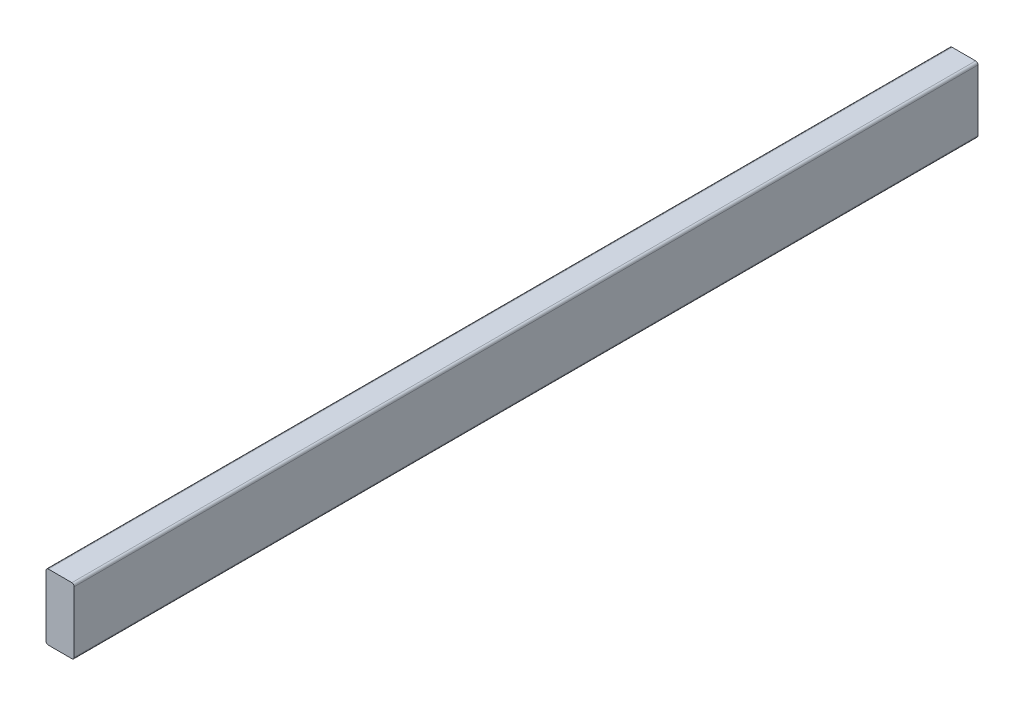
ISO-10303-21;
HEADER;
FILE_DESCRIPTION(('STEP AP214'),'2;1');
FILE_NAME('part.step','',(''),(''),'','','');
FILE_SCHEMA(('AUTOMOTIVE_DESIGN { 1 0 10303 214 1 1 1 1 }'));
ENDSEC;
DATA;
#1=APPLICATION_CONTEXT('core data for automotive mechanical design processes');
#2=APPLICATION_PROTOCOL_DEFINITION('international standard','automotive_design',2000,#1);
#3=PRODUCT_CONTEXT('',#1,'mechanical');
#4=PRODUCT('Part','Part','',(#3));
#5=PRODUCT_RELATED_PRODUCT_CATEGORY('part','',(#4));
#6=PRODUCT_DEFINITION_FORMATION('','',#4);
#7=PRODUCT_DEFINITION_CONTEXT('part definition',#1,'design');
#8=PRODUCT_DEFINITION('design','',#6,#7);
#9=PRODUCT_DEFINITION_SHAPE('','',#8);
#10=(LENGTH_UNIT() NAMED_UNIT(*) SI_UNIT(.MILLI.,.METRE.));
#11=(NAMED_UNIT(*) PLANE_ANGLE_UNIT() SI_UNIT($,.RADIAN.));
#12=(NAMED_UNIT(*) SI_UNIT($,.STERADIAN.) SOLID_ANGLE_UNIT());
#13=UNCERTAINTY_MEASURE_WITH_UNIT(LENGTH_MEASURE(1.E-05),#10,'distance_accuracy_value','');
#14=(GEOMETRIC_REPRESENTATION_CONTEXT(3) GLOBAL_UNCERTAINTY_ASSIGNED_CONTEXT((#13)) GLOBAL_UNIT_ASSIGNED_CONTEXT((#10,
#11,#12)) REPRESENTATION_CONTEXT('',''));
#15=CARTESIAN_POINT('',(0.,0.,0.));
#16=DIRECTION('',(0.,0.,1.));
#17=DIRECTION('',(1.,0.,0.));
#18=AXIS2_PLACEMENT_3D('',#15,#16,#17);
#19=CARTESIAN_POINT('',(19.05,-44.45,1219.2));
#20=DIRECTION('',(-1.,0.,0.));
#21=DIRECTION('',(0.,0.,1.));
#22=AXIS2_PLACEMENT_3D('',#19,#20,#21);
#23=PLANE('',#22);
#24=DIRECTION('',(0.,1.,0.));
#25=VECTOR('',#24,1.);
#26=CARTESIAN_POINT('',(19.05,-44.45,1219.2));
#27=LINE('',#26,#25);
#28=CARTESIAN_POINT('',(19.05,-41.275,1219.2));
#29=VERTEX_POINT('',#28);
#30=CARTESIAN_POINT('',(19.05,41.275,1219.2));
#31=VERTEX_POINT('',#30);
#32=EDGE_CURVE('E132',#29,#31,#27,.T.);
#33=ORIENTED_EDGE('',*,*,#32,.F.);
#34=DIRECTION('',(0.,0.,-1.));
#35=VECTOR('',#34,1.);
#36=CARTESIAN_POINT('',(19.05,-41.275,1219.2));
#37=LINE('',#36,#35);
#38=CARTESIAN_POINT('',(19.05,-41.275,0.));
#39=VERTEX_POINT('',#38);
#40=EDGE_CURVE('E172',#29,#39,#37,.T.);
#41=ORIENTED_EDGE('',*,*,#40,.T.);
#42=DIRECTION('',(0.,1.,0.));
#43=VECTOR('',#42,1.);
#44=CARTESIAN_POINT('',(19.05,-44.45,0.));
#45=LINE('',#44,#43);
#46=CARTESIAN_POINT('',(19.05,41.275,0.));
#47=VERTEX_POINT('',#46);
#48=EDGE_CURVE('E184',#39,#47,#45,.T.);
#49=ORIENTED_EDGE('',*,*,#48,.T.);
#50=DIRECTION('',(0.,0.,-1.));
#51=VECTOR('',#50,1.);
#52=CARTESIAN_POINT('',(19.05,41.275,1219.2));
#53=LINE('',#52,#51);
#54=EDGE_CURVE('E169',#47,#31,#53,.F.);
#55=ORIENTED_EDGE('',*,*,#54,.T.);
#56=EDGE_LOOP('',(#33,#41,#49,#55));
#57=FACE_BOUND('',#56,.T.);
#58=ADVANCED_FACE('F37',(#57),#23,.F.);
#59=CARTESIAN_POINT('',(-19.05,44.45,1219.2));
#60=DIRECTION('',(0.,-1.,0.));
#61=DIRECTION('',(0.,0.,-1.));
#62=AXIS2_PLACEMENT_3D('',#59,#60,#61);
#63=PLANE('',#62);
#64=DIRECTION('',(-1.,0.,0.));
#65=VECTOR('',#64,1.);
#66=CARTESIAN_POINT('',(-19.05,44.45,0.));
#67=LINE('',#66,#65);
#68=CARTESIAN_POINT('',(15.875,44.45,0.));
#69=VERTEX_POINT('',#68);
#70=CARTESIAN_POINT('',(-15.875,44.45,0.));
#71=VERTEX_POINT('',#70);
#72=EDGE_CURVE('E140',#69,#71,#67,.T.);
#73=ORIENTED_EDGE('',*,*,#72,.T.);
#74=DIRECTION('',(0.,0.,-1.));
#75=VECTOR('',#74,1.);
#76=CARTESIAN_POINT('',(-15.875,44.45,1219.2));
#77=LINE('',#76,#75);
#78=CARTESIAN_POINT('',(-15.875,44.45,1219.2));
#79=VERTEX_POINT('',#78);
#80=EDGE_CURVE('E11',#71,#79,#77,.F.);
#81=ORIENTED_EDGE('',*,*,#80,.T.);
#82=DIRECTION('',(-1.,0.,0.));
#83=VECTOR('',#82,1.);
#84=CARTESIAN_POINT('',(-19.05,44.45,1219.2));
#85=LINE('',#84,#83);
#86=CARTESIAN_POINT('',(15.875,44.45,1219.2));
#87=VERTEX_POINT('',#86);
#88=EDGE_CURVE('E138',#87,#79,#85,.T.);
#89=ORIENTED_EDGE('',*,*,#88,.F.);
#90=DIRECTION('',(0.,0.,-1.));
#91=VECTOR('',#90,1.);
#92=CARTESIAN_POINT('',(15.875,44.45,1219.2));
#93=LINE('',#92,#91);
#94=EDGE_CURVE('E46',#87,#69,#93,.T.);
#95=ORIENTED_EDGE('',*,*,#94,.T.);
#96=EDGE_LOOP('',(#73,#81,#89,#95));
#97=FACE_BOUND('',#96,.T.);
#98=ADVANCED_FACE('F180',(#97),#63,.F.);
#99=CARTESIAN_POINT('',(-19.05,-44.45,1219.2));
#100=DIRECTION('',(1.,0.,0.));
#101=DIRECTION('',(0.,0.,-1.));
#102=AXIS2_PLACEMENT_3D('',#99,#100,#101);
#103=PLANE('',#102);
#104=DIRECTION('',(0.,-1.,0.));
#105=VECTOR('',#104,1.);
#106=CARTESIAN_POINT('',(-19.05,-44.45,0.));
#107=LINE('',#106,#105);
#108=CARTESIAN_POINT('',(-19.05,41.275,0.));
#109=VERTEX_POINT('',#108);
#110=CARTESIAN_POINT('',(-19.05,-41.275,0.));
#111=VERTEX_POINT('',#110);
#112=EDGE_CURVE('E133',#109,#111,#107,.T.);
#113=ORIENTED_EDGE('',*,*,#112,.T.);
#114=DIRECTION('',(0.,0.,-1.));
#115=VECTOR('',#114,1.);
#116=CARTESIAN_POINT('',(-19.05,-41.275,1219.2));
#117=LINE('',#116,#115);
#118=CARTESIAN_POINT('',(-19.05,-41.275,1219.2));
#119=VERTEX_POINT('',#118);
#120=EDGE_CURVE('E108',#111,#119,#117,.F.);
#121=ORIENTED_EDGE('',*,*,#120,.T.);
#122=DIRECTION('',(0.,-1.,0.));
#123=VECTOR('',#122,1.);
#124=CARTESIAN_POINT('',(-19.05,-44.45,1219.2));
#125=LINE('',#124,#123);
#126=CARTESIAN_POINT('',(-19.05,41.275,1219.2));
#127=VERTEX_POINT('',#126);
#128=EDGE_CURVE('E191',#127,#119,#125,.T.);
#129=ORIENTED_EDGE('',*,*,#128,.F.);
#130=DIRECTION('',(0.,0.,-1.));
#131=VECTOR('',#130,1.);
#132=CARTESIAN_POINT('',(-19.05,41.275,1219.2));
#133=LINE('',#132,#131);
#134=EDGE_CURVE('E114',#127,#109,#133,.T.);
#135=ORIENTED_EDGE('',*,*,#134,.T.);
#136=EDGE_LOOP('',(#113,#121,#129,#135));
#137=FACE_BOUND('',#136,.T.);
#138=ADVANCED_FACE('F204',(#137),#103,.F.);
#139=CARTESIAN_POINT('',(-19.05,-44.45,1219.2));
#140=DIRECTION('',(0.,1.,0.));
#141=DIRECTION('',(0.,0.,1.));
#142=AXIS2_PLACEMENT_3D('',#139,#140,#141);
#143=PLANE('',#142);
#144=DIRECTION('',(1.,0.,0.));
#145=VECTOR('',#144,1.);
#146=CARTESIAN_POINT('',(-19.05,-44.45,1219.2));
#147=LINE('',#146,#145);
#148=CARTESIAN_POINT('',(-15.875,-44.45,1219.2));
#149=VERTEX_POINT('',#148);
#150=CARTESIAN_POINT('',(15.875,-44.45,1219.2));
#151=VERTEX_POINT('',#150);
#152=EDGE_CURVE('E124',#149,#151,#147,.T.);
#153=ORIENTED_EDGE('',*,*,#152,.F.);
#154=DIRECTION('',(0.,0.,-1.));
#155=VECTOR('',#154,1.);
#156=CARTESIAN_POINT('',(-15.875,-44.45,1219.2));
#157=LINE('',#156,#155);
#158=CARTESIAN_POINT('',(-15.875,-44.45,0.));
#159=VERTEX_POINT('',#158);
#160=EDGE_CURVE('E107',#149,#159,#157,.T.);
#161=ORIENTED_EDGE('',*,*,#160,.T.);
#162=DIRECTION('',(1.,0.,0.));
#163=VECTOR('',#162,1.);
#164=CARTESIAN_POINT('',(-19.05,-44.45,0.));
#165=LINE('',#164,#163);
#166=CARTESIAN_POINT('',(15.875,-44.45,0.));
#167=VERTEX_POINT('',#166);
#168=EDGE_CURVE('E121',#159,#167,#165,.T.);
#169=ORIENTED_EDGE('',*,*,#168,.T.);
#170=DIRECTION('',(0.,0.,-1.));
#171=VECTOR('',#170,1.);
#172=CARTESIAN_POINT('',(15.875,-44.45,1219.2));
#173=LINE('',#172,#171);
#174=EDGE_CURVE('E127',#167,#151,#173,.F.);
#175=ORIENTED_EDGE('',*,*,#174,.T.);
#176=EDGE_LOOP('',(#153,#161,#169,#175));
#177=FACE_BOUND('',#176,.T.);
#178=ADVANCED_FACE('F120',(#177),#143,.F.);
#179=CARTESIAN_POINT('',(0.,0.,1219.2));
#180=DIRECTION('',(0.,0.,-1.));
#181=DIRECTION('',(-1.,0.,0.));
#182=AXIS2_PLACEMENT_3D('',#179,#180,#181);
#183=PLANE('',#182);
#184=ORIENTED_EDGE('',*,*,#128,.T.);
#185=CARTESIAN_POINT('',(-15.875,-41.275,1219.2));
#186=DIRECTION('',(0.,0.,-1.));
#187=DIRECTION('',(-1.,0.,0.));
#188=AXIS2_PLACEMENT_3D('',#185,#186,#187);
#189=CIRCLE('',#188,3.175);
#190=EDGE_CURVE('E166',#119,#149,#189,.F.);
#191=ORIENTED_EDGE('',*,*,#190,.T.);
#192=ORIENTED_EDGE('',*,*,#152,.T.);
#193=CARTESIAN_POINT('',(15.875,-41.275,1219.2));
#194=DIRECTION('',(0.,0.,-1.));
#195=DIRECTION('',(-1.,0.,0.));
#196=AXIS2_PLACEMENT_3D('',#193,#194,#195);
#197=CIRCLE('',#196,3.175);
#198=EDGE_CURVE('E163',#151,#29,#197,.F.);
#199=ORIENTED_EDGE('',*,*,#198,.T.);
#200=ORIENTED_EDGE('',*,*,#32,.T.);
#201=CARTESIAN_POINT('',(15.875,41.275,1219.2));
#202=DIRECTION('',(0.,0.,-1.));
#203=DIRECTION('',(-1.,0.,0.));
#204=AXIS2_PLACEMENT_3D('',#201,#202,#203);
#205=CIRCLE('',#204,3.175);
#206=EDGE_CURVE('E58',#31,#87,#205,.F.);
#207=ORIENTED_EDGE('',*,*,#206,.T.);
#208=ORIENTED_EDGE('',*,*,#88,.T.);
#209=CARTESIAN_POINT('',(-15.875,41.275,1219.2));
#210=DIRECTION('',(0.,0.,-1.));
#211=DIRECTION('',(-1.,0.,0.));
#212=AXIS2_PLACEMENT_3D('',#209,#210,#211);
#213=CIRCLE('',#212,3.175);
#214=EDGE_CURVE('E160',#79,#127,#213,.F.);
#215=ORIENTED_EDGE('',*,*,#214,.T.);
#216=EDGE_LOOP('',(#184,#191,#192,#199,#200,#207,#208,#215));
#217=FACE_BOUND('',#216,.T.);
#218=ADVANCED_FACE('F198',(#217),#183,.F.);
#219=CARTESIAN_POINT('',(0.,0.,0.));
#220=DIRECTION('',(0.,0.,-1.));
#221=DIRECTION('',(-1.,0.,0.));
#222=AXIS2_PLACEMENT_3D('',#219,#220,#221);
#223=PLANE('',#222);
#224=ORIENTED_EDGE('',*,*,#168,.F.);
#225=CARTESIAN_POINT('',(-15.875,-41.275,0.));
#226=DIRECTION('',(0.,0.,-1.));
#227=DIRECTION('',(-1.,0.,0.));
#228=AXIS2_PLACEMENT_3D('',#225,#226,#227);
#229=CIRCLE('',#228,3.175);
#230=EDGE_CURVE('E103',#159,#111,#229,.T.);
#231=ORIENTED_EDGE('',*,*,#230,.T.);
#232=ORIENTED_EDGE('',*,*,#112,.F.);
#233=CARTESIAN_POINT('',(-15.875,41.275,0.));
#234=DIRECTION('',(0.,0.,-1.));
#235=DIRECTION('',(-1.,0.,0.));
#236=AXIS2_PLACEMENT_3D('',#233,#234,#235);
#237=CIRCLE('',#236,3.175);
#238=EDGE_CURVE('E148',#109,#71,#237,.T.);
#239=ORIENTED_EDGE('',*,*,#238,.T.);
#240=ORIENTED_EDGE('',*,*,#72,.F.);
#241=CARTESIAN_POINT('',(15.875,41.275,0.));
#242=DIRECTION('',(0.,0.,-1.));
#243=DIRECTION('',(-1.,0.,0.));
#244=AXIS2_PLACEMENT_3D('',#241,#242,#243);
#245=CIRCLE('',#244,3.175);
#246=EDGE_CURVE('E126',#69,#47,#245,.T.);
#247=ORIENTED_EDGE('',*,*,#246,.T.);
#248=ORIENTED_EDGE('',*,*,#48,.F.);
#249=CARTESIAN_POINT('',(15.875,-41.275,0.));
#250=DIRECTION('',(0.,0.,-1.));
#251=DIRECTION('',(-1.,0.,0.));
#252=AXIS2_PLACEMENT_3D('',#249,#250,#251);
#253=CIRCLE('',#252,3.175);
#254=EDGE_CURVE('E115',#39,#167,#253,.T.);
#255=ORIENTED_EDGE('',*,*,#254,.T.);
#256=EDGE_LOOP('',(#224,#231,#232,#239,#240,#247,#248,#255));
#257=FACE_BOUND('',#256,.T.);
#258=ADVANCED_FACE('F129',(#257),#223,.T.);
#259=CARTESIAN_POINT('',(-15.875,-41.275,1219.2));
#260=DIRECTION('',(0.,0.,-1.));
#261=DIRECTION('',(-1.,0.,0.));
#262=AXIS2_PLACEMENT_3D('',#259,#260,#261);
#263=CYLINDRICAL_SURFACE('',#262,3.175);
#264=ORIENTED_EDGE('',*,*,#190,.F.);
#265=ORIENTED_EDGE('',*,*,#120,.F.);
#266=ORIENTED_EDGE('',*,*,#230,.F.);
#267=ORIENTED_EDGE('',*,*,#160,.F.);
#268=EDGE_LOOP('',(#264,#265,#266,#267));
#269=FACE_BOUND('',#268,.T.);
#270=ADVANCED_FACE('F106',(#269),#263,.T.);
#271=CARTESIAN_POINT('',(15.875,-41.275,1219.2));
#272=DIRECTION('',(0.,0.,-1.));
#273=DIRECTION('',(-1.,0.,0.));
#274=AXIS2_PLACEMENT_3D('',#271,#272,#273);
#275=CYLINDRICAL_SURFACE('',#274,3.175);
#276=ORIENTED_EDGE('',*,*,#198,.F.);
#277=ORIENTED_EDGE('',*,*,#174,.F.);
#278=ORIENTED_EDGE('',*,*,#254,.F.);
#279=ORIENTED_EDGE('',*,*,#40,.F.);
#280=EDGE_LOOP('',(#276,#277,#278,#279));
#281=FACE_BOUND('',#280,.T.);
#282=ADVANCED_FACE('F209',(#281),#275,.T.);
#283=CARTESIAN_POINT('',(-15.875,41.275,1219.2));
#284=DIRECTION('',(0.,0.,-1.));
#285=DIRECTION('',(-1.,0.,0.));
#286=AXIS2_PLACEMENT_3D('',#283,#284,#285);
#287=CYLINDRICAL_SURFACE('',#286,3.175);
#288=ORIENTED_EDGE('',*,*,#214,.F.);
#289=ORIENTED_EDGE('',*,*,#80,.F.);
#290=ORIENTED_EDGE('',*,*,#238,.F.);
#291=ORIENTED_EDGE('',*,*,#134,.F.);
#292=EDGE_LOOP('',(#288,#289,#290,#291));
#293=FACE_BOUND('',#292,.T.);
#294=ADVANCED_FACE('F202',(#293),#287,.T.);
#295=CARTESIAN_POINT('',(15.875,41.275,1219.2));
#296=DIRECTION('',(0.,0.,-1.));
#297=DIRECTION('',(-1.,0.,0.));
#298=AXIS2_PLACEMENT_3D('',#295,#296,#297);
#299=CYLINDRICAL_SURFACE('',#298,3.175);
#300=ORIENTED_EDGE('',*,*,#206,.F.);
#301=ORIENTED_EDGE('',*,*,#54,.F.);
#302=ORIENTED_EDGE('',*,*,#246,.F.);
#303=ORIENTED_EDGE('',*,*,#94,.F.);
#304=EDGE_LOOP('',(#300,#301,#302,#303));
#305=FACE_BOUND('',#304,.T.);
#306=ADVANCED_FACE('F39',(#305),#299,.T.);
#307=CLOSED_SHELL('',(#58,#98,#138,#178,#218,#258,#270,#282,#294,#306));
#308=MANIFOLD_SOLID_BREP('B2',#307);
#309=ADVANCED_BREP_SHAPE_REPRESENTATION('',(#18,#308),#14);
#310=SHAPE_DEFINITION_REPRESENTATION(#9,#309);
ENDSEC;
END-ISO-10303-21;
